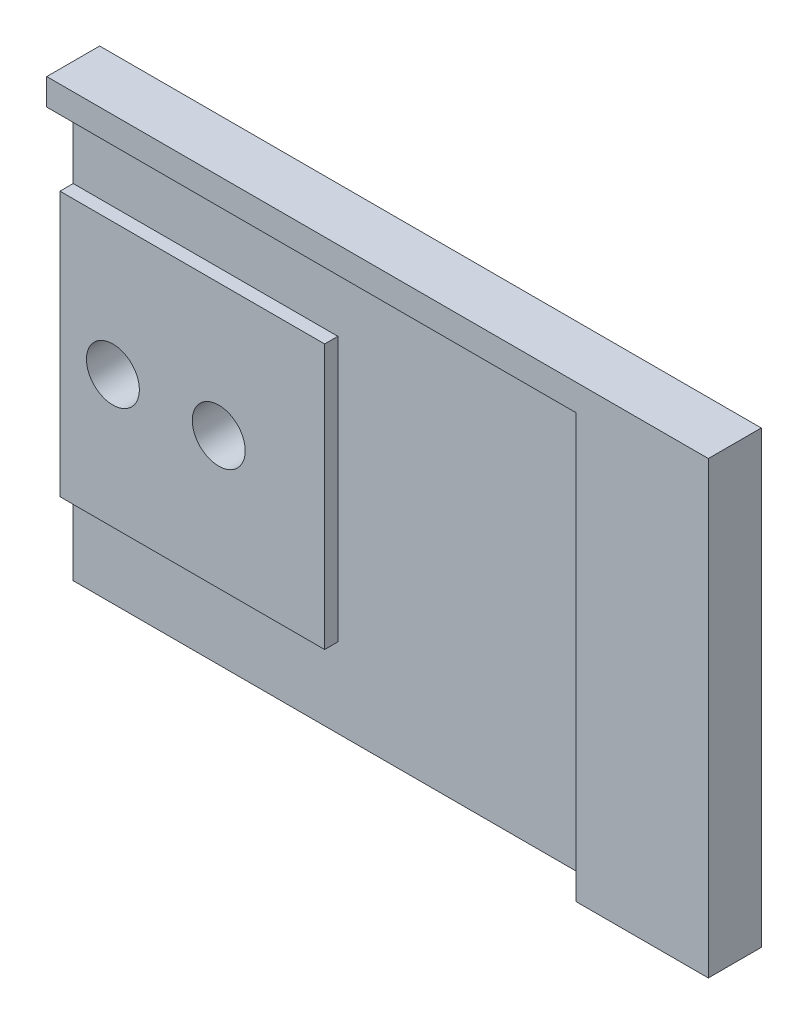
ISO-10303-21;
HEADER;
FILE_DESCRIPTION(('STEP AP214'),'2;1');
FILE_NAME('part.step','',(''),(''),'','','');
FILE_SCHEMA(('AUTOMOTIVE_DESIGN { 1 0 10303 214 1 1 1 1 }'));
ENDSEC;
DATA;
#1=APPLICATION_CONTEXT('core data for automotive mechanical design processes');
#2=APPLICATION_PROTOCOL_DEFINITION('international standard','automotive_design',2000,#1);
#3=PRODUCT_CONTEXT('',#1,'mechanical');
#4=PRODUCT('Part','Part','',(#3));
#5=PRODUCT_RELATED_PRODUCT_CATEGORY('part','',(#4));
#6=PRODUCT_DEFINITION_FORMATION('','',#4);
#7=PRODUCT_DEFINITION_CONTEXT('part definition',#1,'design');
#8=PRODUCT_DEFINITION('design','',#6,#7);
#9=PRODUCT_DEFINITION_SHAPE('','',#8);
#10=(LENGTH_UNIT() NAMED_UNIT(*) SI_UNIT(.MILLI.,.METRE.));
#11=(NAMED_UNIT(*) PLANE_ANGLE_UNIT() SI_UNIT($,.RADIAN.));
#12=(NAMED_UNIT(*) SI_UNIT($,.STERADIAN.) SOLID_ANGLE_UNIT());
#13=UNCERTAINTY_MEASURE_WITH_UNIT(LENGTH_MEASURE(1.E-05),#10,'distance_accuracy_value','');
#14=(GEOMETRIC_REPRESENTATION_CONTEXT(3) GLOBAL_UNCERTAINTY_ASSIGNED_CONTEXT((#13)) GLOBAL_UNIT_ASSIGNED_CONTEXT((#10,
#11,#12)) REPRESENTATION_CONTEXT('',''));
#15=CARTESIAN_POINT('',(0.,0.,0.));
#16=DIRECTION('',(0.,0.,1.));
#17=DIRECTION('',(1.,0.,0.));
#18=AXIS2_PLACEMENT_3D('',#15,#16,#17);
#19=CARTESIAN_POINT('',(0.,0.,5.));
#20=DIRECTION('',(0.,0.,1.));
#21=DIRECTION('',(1.,0.,0.));
#22=AXIS2_PLACEMENT_3D('',#19,#20,#21);
#23=PLANE('',#22);
#24=DIRECTION('',(0.,1.,0.));
#25=VECTOR('',#24,1.);
#26=CARTESIAN_POINT('',(3.71385187449574,0.799363057324837,5.));
#27=LINE('',#26,#25);
#28=CARTESIAN_POINT('',(3.71385187449575,-49.2006369426752,5.));
#29=VERTEX_POINT('',#28);
#30=CARTESIAN_POINT('',(3.71385187449574,0.799363057324837,5.));
#31=VERTEX_POINT('',#30);
#32=EDGE_CURVE('E251',#29,#31,#27,.T.);
#33=ORIENTED_EDGE('',*,*,#32,.F.);
#34=DIRECTION('',(1.,0.,0.));
#35=VECTOR('',#34,1.);
#36=CARTESIAN_POINT('',(-46.2861481255043,-49.2006369426752,5.));
#37=LINE('',#36,#35);
#38=CARTESIAN_POINT('',(-46.2861481255043,-49.2006369426752,5.));
#39=VERTEX_POINT('',#38);
#40=EDGE_CURVE('E248',#39,#29,#37,.T.);
#41=ORIENTED_EDGE('',*,*,#40,.F.);
#42=DIRECTION('',(0.,-1.,0.));
#43=VECTOR('',#42,1.);
#44=CARTESIAN_POINT('',(-46.2861481255043,15.7993630573248,5.));
#45=LINE('',#44,#43);
#46=CARTESIAN_POINT('',(-46.2861481255043,-64.2006369426752,5.));
#47=VERTEX_POINT('',#46);
#48=EDGE_CURVE('E149',#39,#47,#45,.T.);
#49=ORIENTED_EDGE('',*,*,#48,.T.);
#50=DIRECTION('',(1.,0.,0.));
#51=VECTOR('',#50,1.);
#52=CARTESIAN_POINT('',(-46.2861481255043,-64.2006369426752,5.));
#53=LINE('',#52,#51);
#54=CARTESIAN_POINT('',(53.7138518744958,-64.2006369426752,5.));
#55=VERTEX_POINT('',#54);
#56=EDGE_CURVE('E164',#47,#55,#53,.T.);
#57=ORIENTED_EDGE('',*,*,#56,.T.);
#58=DIRECTION('',(0.,1.,0.));
#59=VECTOR('',#58,1.);
#60=CARTESIAN_POINT('',(53.7138518744957,15.7993630573248,5.));
#61=LINE('',#60,#59);
#62=CARTESIAN_POINT('',(53.7138518744957,15.7993630573248,5.));
#63=VERTEX_POINT('',#62);
#64=EDGE_CURVE('E168',#55,#63,#61,.T.);
#65=ORIENTED_EDGE('',*,*,#64,.T.);
#66=DIRECTION('',(-1.,0.,0.));
#67=VECTOR('',#66,1.);
#68=CARTESIAN_POINT('',(-46.2861481255043,15.7993630573248,5.));
#69=LINE('',#68,#67);
#70=CARTESIAN_POINT('',(-46.2861481255043,15.7993630573248,5.));
#71=VERTEX_POINT('',#70);
#72=EDGE_CURVE('E172',#63,#71,#69,.T.);
#73=ORIENTED_EDGE('',*,*,#72,.T.);
#74=CARTESIAN_POINT('',(-46.2861481255043,0.799363057324837,5.));
#75=VERTEX_POINT('',#74);
#76=EDGE_CURVE('E160',#71,#75,#45,.T.);
#77=ORIENTED_EDGE('',*,*,#76,.T.);
#78=DIRECTION('',(-1.,0.,0.));
#79=VECTOR('',#78,1.);
#80=CARTESIAN_POINT('',(-46.2861481255043,0.799363057324837,5.));
#81=LINE('',#80,#79);
#82=EDGE_CURVE('E144',#31,#75,#81,.T.);
#83=ORIENTED_EDGE('',*,*,#82,.F.);
#84=EDGE_LOOP('',(#33,#41,#49,#57,#65,#73,#77,#83));
#85=FACE_BOUND('',#84,.T.);
#86=ADVANCED_FACE('F39',(#85),#23,.T.);
#87=CARTESIAN_POINT('',(-46.2861481255043,20.7993630573248,10.));
#88=DIRECTION('',(1.,0.,0.));
#89=DIRECTION('',(0.,1.,0.));
#90=AXIS2_PLACEMENT_3D('',#87,#88,#89);
#91=PLANE('',#90);
#92=ORIENTED_EDGE('',*,*,#76,.F.);
#93=DIRECTION('',(0.,0.,1.));
#94=VECTOR('',#93,1.);
#95=CARTESIAN_POINT('',(-46.2861481255043,15.7993630573248,5.));
#96=LINE('',#95,#94);
#97=CARTESIAN_POINT('',(-46.2861481255043,15.7993630573248,10.));
#98=VERTEX_POINT('',#97);
#99=EDGE_CURVE('E178',#71,#98,#96,.T.);
#100=ORIENTED_EDGE('',*,*,#99,.T.);
#101=DIRECTION('',(0.,-1.,0.));
#102=VECTOR('',#101,1.);
#103=CARTESIAN_POINT('',(-46.2861481255043,20.7993630573248,10.));
#104=LINE('',#103,#102);
#105=CARTESIAN_POINT('',(-46.2861481255043,20.7993630573248,10.));
#106=VERTEX_POINT('',#105);
#107=EDGE_CURVE('E188',#106,#98,#104,.T.);
#108=ORIENTED_EDGE('',*,*,#107,.F.);
#109=DIRECTION('',(0.,0.,-1.));
#110=VECTOR('',#109,1.);
#111=CARTESIAN_POINT('',(-46.2861481255043,20.7993630573248,10.));
#112=LINE('',#111,#110);
#113=CARTESIAN_POINT('',(-46.2861481255043,20.7993630573248,0.));
#114=VERTEX_POINT('',#113);
#115=EDGE_CURVE('E202',#106,#114,#112,.T.);
#116=ORIENTED_EDGE('',*,*,#115,.T.);
#117=DIRECTION('',(0.,-1.,0.));
#118=VECTOR('',#117,1.);
#119=CARTESIAN_POINT('',(-46.2861481255043,20.7993630573248,0.));
#120=LINE('',#119,#118);
#121=CARTESIAN_POINT('',(-46.2861481255042,-64.2006369426752,0.));
#122=VERTEX_POINT('',#121);
#123=EDGE_CURVE('E182',#114,#122,#120,.T.);
#124=ORIENTED_EDGE('',*,*,#123,.T.);
#125=DIRECTION('',(0.,0.,-1.));
#126=VECTOR('',#125,1.);
#127=CARTESIAN_POINT('',(-46.2861481255042,-64.2006369426752,10.));
#128=LINE('',#127,#126);
#129=EDGE_CURVE('E11',#47,#122,#128,.T.);
#130=ORIENTED_EDGE('',*,*,#129,.F.);
#131=ORIENTED_EDGE('',*,*,#48,.F.);
#132=DIRECTION('',(0.,0.,-1.));
#133=VECTOR('',#132,1.);
#134=CARTESIAN_POINT('',(-46.2861481255043,-49.2006369426752,7.5));
#135=LINE('',#134,#133);
#136=CARTESIAN_POINT('',(-46.2861481255043,-49.2006369426752,7.5));
#137=VERTEX_POINT('',#136);
#138=EDGE_CURVE('E127',#137,#39,#135,.T.);
#139=ORIENTED_EDGE('',*,*,#138,.F.);
#140=DIRECTION('',(0.,-1.,0.));
#141=VECTOR('',#140,1.);
#142=CARTESIAN_POINT('',(-46.2861481255043,0.799363057324837,7.5));
#143=LINE('',#142,#141);
#144=CARTESIAN_POINT('',(-46.2861481255043,0.799363057324837,7.5));
#145=VERTEX_POINT('',#144);
#146=EDGE_CURVE('E135',#145,#137,#143,.T.);
#147=ORIENTED_EDGE('',*,*,#146,.F.);
#148=DIRECTION('',(0.,0.,-1.));
#149=VECTOR('',#148,1.);
#150=CARTESIAN_POINT('',(-46.2861481255043,0.799363057324837,7.5));
#151=LINE('',#150,#149);
#152=EDGE_CURVE('E266',#145,#75,#151,.T.);
#153=ORIENTED_EDGE('',*,*,#152,.T.);
#154=EDGE_LOOP('',(#92,#100,#108,#116,#124,#130,#131,#139,#147,#153));
#155=FACE_BOUND('',#154,.T.);
#156=ADVANCED_FACE('F41',(#155),#91,.F.);
#157=CARTESIAN_POINT('',(-46.2861481255042,-64.2006369426752,10.));
#158=DIRECTION('',(0.,1.,0.));
#159=DIRECTION('',(0.,0.,1.));
#160=AXIS2_PLACEMENT_3D('',#157,#158,#159);
#161=PLANE('',#160);
#162=DIRECTION('',(1.,0.,0.));
#163=VECTOR('',#162,1.);
#164=CARTESIAN_POINT('',(-46.2861481255042,-64.2006369426752,10.));
#165=LINE('',#164,#163);
#166=CARTESIAN_POINT('',(53.7138518744958,-64.2006369426752,10.));
#167=VERTEX_POINT('',#166);
#168=CARTESIAN_POINT('',(78.7138518744958,-64.2006369426752,10.));
#169=VERTEX_POINT('',#168);
#170=EDGE_CURVE('E192',#167,#169,#165,.T.);
#171=ORIENTED_EDGE('',*,*,#170,.F.);
#172=DIRECTION('',(0.,0.,1.));
#173=VECTOR('',#172,1.);
#174=CARTESIAN_POINT('',(53.7138518744958,-64.2006369426752,5.));
#175=LINE('',#174,#173);
#176=EDGE_CURVE('E63',#55,#167,#175,.T.);
#177=ORIENTED_EDGE('',*,*,#176,.F.);
#178=ORIENTED_EDGE('',*,*,#56,.F.);
#179=ORIENTED_EDGE('',*,*,#129,.T.);
#180=DIRECTION('',(1.,0.,0.));
#181=VECTOR('',#180,1.);
#182=CARTESIAN_POINT('',(-46.2861481255042,-64.2006369426752,0.));
#183=LINE('',#182,#181);
#184=CARTESIAN_POINT('',(78.7138518744958,-64.2006369426752,0.));
#185=VERTEX_POINT('',#184);
#186=EDGE_CURVE('E206',#122,#185,#183,.T.);
#187=ORIENTED_EDGE('',*,*,#186,.T.);
#188=DIRECTION('',(0.,0.,-1.));
#189=VECTOR('',#188,1.);
#190=CARTESIAN_POINT('',(78.7138518744958,-64.2006369426752,10.));
#191=LINE('',#190,#189);
#192=EDGE_CURVE('E48',#169,#185,#191,.T.);
#193=ORIENTED_EDGE('',*,*,#192,.F.);
#194=EDGE_LOOP('',(#171,#177,#178,#179,#187,#193));
#195=FACE_BOUND('',#194,.T.);
#196=ADVANCED_FACE('F243',(#195),#161,.F.);
#197=CARTESIAN_POINT('',(78.7138518744958,20.7993630573248,10.));
#198=DIRECTION('',(-1.,0.,0.));
#199=DIRECTION('',(0.,0.,1.));
#200=AXIS2_PLACEMENT_3D('',#197,#198,#199);
#201=PLANE('',#200);
#202=DIRECTION('',(0.,1.,0.));
#203=VECTOR('',#202,1.);
#204=CARTESIAN_POINT('',(78.7138518744958,20.7993630573248,0.));
#205=LINE('',#204,#203);
#206=CARTESIAN_POINT('',(78.7138518744958,20.7993630573248,0.));
#207=VERTEX_POINT('',#206);
#208=EDGE_CURVE('E209',#185,#207,#205,.T.);
#209=ORIENTED_EDGE('',*,*,#208,.T.);
#210=DIRECTION('',(0.,0.,-1.));
#211=VECTOR('',#210,1.);
#212=CARTESIAN_POINT('',(78.7138518744958,20.7993630573248,10.));
#213=LINE('',#212,#211);
#214=CARTESIAN_POINT('',(78.7138518744958,20.7993630573248,10.));
#215=VERTEX_POINT('',#214);
#216=EDGE_CURVE('E217',#215,#207,#213,.T.);
#217=ORIENTED_EDGE('',*,*,#216,.F.);
#218=DIRECTION('',(0.,1.,0.));
#219=VECTOR('',#218,1.);
#220=CARTESIAN_POINT('',(78.7138518744958,20.7993630573248,10.));
#221=LINE('',#220,#219);
#222=EDGE_CURVE('E196',#169,#215,#221,.T.);
#223=ORIENTED_EDGE('',*,*,#222,.F.);
#224=ORIENTED_EDGE('',*,*,#192,.T.);
#225=EDGE_LOOP('',(#209,#217,#223,#224));
#226=FACE_BOUND('',#225,.T.);
#227=ADVANCED_FACE('F226',(#226),#201,.F.);
#228=CARTESIAN_POINT('',(-46.2861481255043,20.7993630573248,10.));
#229=DIRECTION('',(0.,-1.,0.));
#230=DIRECTION('',(0.,0.,-1.));
#231=AXIS2_PLACEMENT_3D('',#228,#229,#230);
#232=PLANE('',#231);
#233=DIRECTION('',(-1.,0.,0.));
#234=VECTOR('',#233,1.);
#235=CARTESIAN_POINT('',(-46.2861481255043,20.7993630573248,0.));
#236=LINE('',#235,#234);
#237=EDGE_CURVE('E193',#207,#114,#236,.T.);
#238=ORIENTED_EDGE('',*,*,#237,.T.);
#239=ORIENTED_EDGE('',*,*,#115,.F.);
#240=DIRECTION('',(-1.,0.,0.));
#241=VECTOR('',#240,1.);
#242=CARTESIAN_POINT('',(-46.2861481255043,20.7993630573248,10.));
#243=LINE('',#242,#241);
#244=EDGE_CURVE('E199',#215,#106,#243,.T.);
#245=ORIENTED_EDGE('',*,*,#244,.F.);
#246=ORIENTED_EDGE('',*,*,#216,.T.);
#247=EDGE_LOOP('',(#238,#239,#245,#246));
#248=FACE_BOUND('',#247,.T.);
#249=ADVANCED_FACE('F237',(#248),#232,.F.);
#250=CARTESIAN_POINT('',(0.,0.,10.));
#251=DIRECTION('',(0.,0.,1.));
#252=DIRECTION('',(1.,0.,0.));
#253=AXIS2_PLACEMENT_3D('',#250,#251,#252);
#254=PLANE('',#253);
#255=DIRECTION('',(-1.,0.,0.));
#256=VECTOR('',#255,1.);
#257=CARTESIAN_POINT('',(-46.2861481255043,15.7993630573248,10.));
#258=LINE('',#257,#256);
#259=CARTESIAN_POINT('',(53.7138518744957,15.7993630573248,10.));
#260=VERTEX_POINT('',#259);
#261=EDGE_CURVE('E155',#260,#98,#258,.T.);
#262=ORIENTED_EDGE('',*,*,#261,.F.);
#263=DIRECTION('',(0.,1.,0.));
#264=VECTOR('',#263,1.);
#265=CARTESIAN_POINT('',(53.7138518744957,15.7993630573248,10.));
#266=LINE('',#265,#264);
#267=EDGE_CURVE('E151',#167,#260,#266,.T.);
#268=ORIENTED_EDGE('',*,*,#267,.F.);
#269=ORIENTED_EDGE('',*,*,#170,.T.);
#270=ORIENTED_EDGE('',*,*,#222,.T.);
#271=ORIENTED_EDGE('',*,*,#244,.T.);
#272=ORIENTED_EDGE('',*,*,#107,.T.);
#273=EDGE_LOOP('',(#262,#268,#269,#270,#271,#272));
#274=FACE_BOUND('',#273,.T.);
#275=ADVANCED_FACE('F242',(#274),#254,.T.);
#276=CARTESIAN_POINT('',(0.,0.,0.));
#277=DIRECTION('',(0.,0.,1.));
#278=DIRECTION('',(1.,0.,0.));
#279=AXIS2_PLACEMENT_3D('',#276,#277,#278);
#280=PLANE('',#279);
#281=CARTESIAN_POINT('',(-36.2861481255043,-24.2006369426752,0.));
#282=DIRECTION('',(0.,0.,1.));
#283=DIRECTION('',(1.,0.,0.));
#284=AXIS2_PLACEMENT_3D('',#281,#282,#283);
#285=CIRCLE('',#284,5.);
#286=CARTESIAN_POINT('',(-31.2861481255043,-24.2006369426752,0.));
#287=VERTEX_POINT('',#286);
#288=EDGE_CURVE('E253',#287,#287,#285,.T.);
#289=ORIENTED_EDGE('',*,*,#288,.T.);
#290=EDGE_LOOP('',(#289));
#291=FACE_BOUND('',#290,.T.);
#292=CARTESIAN_POINT('',(-16.2861481255043,-24.2006369426752,0.));
#293=DIRECTION('',(0.,0.,1.));
#294=DIRECTION('',(1.,0.,0.));
#295=AXIS2_PLACEMENT_3D('',#292,#293,#294);
#296=CIRCLE('',#295,5.);
#297=CARTESIAN_POINT('',(-11.2861481255043,-24.2006369426752,0.));
#298=VERTEX_POINT('',#297);
#299=EDGE_CURVE('E259',#298,#298,#296,.T.);
#300=ORIENTED_EDGE('',*,*,#299,.T.);
#301=EDGE_LOOP('',(#300));
#302=FACE_BOUND('',#301,.T.);
#303=ORIENTED_EDGE('',*,*,#123,.F.);
#304=ORIENTED_EDGE('',*,*,#237,.F.);
#305=ORIENTED_EDGE('',*,*,#208,.F.);
#306=ORIENTED_EDGE('',*,*,#186,.F.);
#307=EDGE_LOOP('',(#303,#304,#305,#306));
#308=FACE_BOUND('',#307,.T.);
#309=ADVANCED_FACE('F234',(#291,#302,#308),#280,.F.);
#310=CARTESIAN_POINT('',(-46.2861481255043,15.7993630573248,5.));
#311=DIRECTION('',(0.,1.,0.));
#312=DIRECTION('',(0.,0.,1.));
#313=AXIS2_PLACEMENT_3D('',#310,#311,#312);
#314=PLANE('',#313);
#315=ORIENTED_EDGE('',*,*,#261,.T.);
#316=ORIENTED_EDGE('',*,*,#99,.F.);
#317=ORIENTED_EDGE('',*,*,#72,.F.);
#318=DIRECTION('',(0.,0.,1.));
#319=VECTOR('',#318,1.);
#320=CARTESIAN_POINT('',(53.7138518744957,15.7993630573248,5.));
#321=LINE('',#320,#319);
#322=EDGE_CURVE('E183',#63,#260,#321,.T.);
#323=ORIENTED_EDGE('',*,*,#322,.T.);
#324=EDGE_LOOP('',(#315,#316,#317,#323));
#325=FACE_BOUND('',#324,.T.);
#326=ADVANCED_FACE('F300',(#325),#314,.F.);
#327=CARTESIAN_POINT('',(53.7138518744957,15.7993630573248,5.));
#328=DIRECTION('',(1.,0.,0.));
#329=DIRECTION('',(0.,1.,0.));
#330=AXIS2_PLACEMENT_3D('',#327,#328,#329);
#331=PLANE('',#330);
#332=ORIENTED_EDGE('',*,*,#267,.T.);
#333=ORIENTED_EDGE('',*,*,#322,.F.);
#334=ORIENTED_EDGE('',*,*,#64,.F.);
#335=ORIENTED_EDGE('',*,*,#176,.T.);
#336=EDGE_LOOP('',(#332,#333,#334,#335));
#337=FACE_BOUND('',#336,.T.);
#338=ADVANCED_FACE('F307',(#337),#331,.F.);
#339=CARTESIAN_POINT('',(-46.2861481255043,-49.2006369426752,7.5));
#340=DIRECTION('',(0.,1.,0.));
#341=DIRECTION('',(-1.,0.,0.));
#342=AXIS2_PLACEMENT_3D('',#339,#340,#341);
#343=PLANE('',#342);
#344=ORIENTED_EDGE('',*,*,#40,.T.);
#345=DIRECTION('',(0.,0.,-1.));
#346=VECTOR('',#345,1.);
#347=CARTESIAN_POINT('',(3.71385187449575,-49.2006369426752,7.5));
#348=LINE('',#347,#346);
#349=CARTESIAN_POINT('',(3.71385187449575,-49.2006369426752,7.5));
#350=VERTEX_POINT('',#349);
#351=EDGE_CURVE('E130',#350,#29,#348,.T.);
#352=ORIENTED_EDGE('',*,*,#351,.F.);
#353=DIRECTION('',(1.,0.,0.));
#354=VECTOR('',#353,1.);
#355=CARTESIAN_POINT('',(-46.2861481255043,-49.2006369426752,7.5));
#356=LINE('',#355,#354);
#357=EDGE_CURVE('E123',#137,#350,#356,.T.);
#358=ORIENTED_EDGE('',*,*,#357,.F.);
#359=ORIENTED_EDGE('',*,*,#138,.T.);
#360=EDGE_LOOP('',(#344,#352,#358,#359));
#361=FACE_BOUND('',#360,.T.);
#362=ADVANCED_FACE('F125',(#361),#343,.F.);
#363=CARTESIAN_POINT('',(3.71385187449574,0.799363057324837,7.5));
#364=DIRECTION('',(-1.,0.,0.));
#365=DIRECTION('',(0.,-1.,0.));
#366=AXIS2_PLACEMENT_3D('',#363,#364,#365);
#367=PLANE('',#366);
#368=ORIENTED_EDGE('',*,*,#32,.T.);
#369=DIRECTION('',(0.,0.,-1.));
#370=VECTOR('',#369,1.);
#371=CARTESIAN_POINT('',(3.71385187449574,0.799363057324837,7.5));
#372=LINE('',#371,#370);
#373=CARTESIAN_POINT('',(3.71385187449574,0.799363057324837,7.5));
#374=VERTEX_POINT('',#373);
#375=EDGE_CURVE('E55',#374,#31,#372,.T.);
#376=ORIENTED_EDGE('',*,*,#375,.F.);
#377=DIRECTION('',(0.,1.,0.));
#378=VECTOR('',#377,1.);
#379=CARTESIAN_POINT('',(3.71385187449574,0.799363057324837,7.5));
#380=LINE('',#379,#378);
#381=EDGE_CURVE('E134',#350,#374,#380,.T.);
#382=ORIENTED_EDGE('',*,*,#381,.F.);
#383=ORIENTED_EDGE('',*,*,#351,.T.);
#384=EDGE_LOOP('',(#368,#376,#382,#383));
#385=FACE_BOUND('',#384,.T.);
#386=ADVANCED_FACE('F324',(#385),#367,.F.);
#387=CARTESIAN_POINT('',(-46.2861481255043,0.799363057324837,7.5));
#388=DIRECTION('',(0.,-1.,0.));
#389=DIRECTION('',(0.,0.,-1.));
#390=AXIS2_PLACEMENT_3D('',#387,#388,#389);
#391=PLANE('',#390);
#392=ORIENTED_EDGE('',*,*,#82,.T.);
#393=ORIENTED_EDGE('',*,*,#152,.F.);
#394=DIRECTION('',(-1.,0.,0.));
#395=VECTOR('',#394,1.);
#396=CARTESIAN_POINT('',(-46.2861481255043,0.799363057324837,7.5));
#397=LINE('',#396,#395);
#398=EDGE_CURVE('E139',#374,#145,#397,.T.);
#399=ORIENTED_EDGE('',*,*,#398,.F.);
#400=ORIENTED_EDGE('',*,*,#375,.T.);
#401=EDGE_LOOP('',(#392,#393,#399,#400));
#402=FACE_BOUND('',#401,.T.);
#403=ADVANCED_FACE('F290',(#402),#391,.F.);
#404=CARTESIAN_POINT('',(0.,0.,7.5));
#405=DIRECTION('',(0.,0.,1.));
#406=DIRECTION('',(1.,0.,0.));
#407=AXIS2_PLACEMENT_3D('',#404,#405,#406);
#408=PLANE('',#407);
#409=CARTESIAN_POINT('',(-36.2861481255043,-24.2006369426752,7.5));
#410=DIRECTION('',(0.,0.,1.));
#411=DIRECTION('',(1.,0.,0.));
#412=AXIS2_PLACEMENT_3D('',#409,#410,#411);
#413=CIRCLE('',#412,5.);
#414=CARTESIAN_POINT('',(-31.2861481255043,-24.2006369426752,7.5));
#415=VERTEX_POINT('',#414);
#416=EDGE_CURVE('E275',#415,#415,#413,.T.);
#417=ORIENTED_EDGE('',*,*,#416,.F.);
#418=EDGE_LOOP('',(#417));
#419=FACE_BOUND('',#418,.T.);
#420=CARTESIAN_POINT('',(-16.2861481255043,-24.2006369426752,7.5));
#421=DIRECTION('',(0.,0.,1.));
#422=DIRECTION('',(1.,0.,0.));
#423=AXIS2_PLACEMENT_3D('',#420,#421,#422);
#424=CIRCLE('',#423,5.);
#425=CARTESIAN_POINT('',(-11.2861481255043,-24.2006369426752,7.5));
#426=VERTEX_POINT('',#425);
#427=EDGE_CURVE('E276',#426,#426,#424,.T.);
#428=ORIENTED_EDGE('',*,*,#427,.F.);
#429=EDGE_LOOP('',(#428));
#430=FACE_BOUND('',#429,.T.);
#431=ORIENTED_EDGE('',*,*,#146,.T.);
#432=ORIENTED_EDGE('',*,*,#357,.T.);
#433=ORIENTED_EDGE('',*,*,#381,.T.);
#434=ORIENTED_EDGE('',*,*,#398,.T.);
#435=EDGE_LOOP('',(#431,#432,#433,#434));
#436=FACE_BOUND('',#435,.T.);
#437=ADVANCED_FACE('F138',(#419,#430,#436),#408,.T.);
#438=CARTESIAN_POINT('',(-16.2861481255043,-24.2006369426752,-15.));
#439=DIRECTION('',(0.,0.,1.));
#440=DIRECTION('',(1.,0.,0.));
#441=AXIS2_PLACEMENT_3D('',#438,#439,#440);
#442=CYLINDRICAL_SURFACE('',#441,5.);
#443=CARTESIAN_POINT('',(-11.2861481255043,-24.2006369426752,7.5));
#444=CARTESIAN_POINT('',(-11.2861481255043,-24.2006369426752,7.421875));
#445=CARTESIAN_POINT('',(-11.2861481255043,-24.2006369426752,7.34375));
#446=CARTESIAN_POINT('',(-11.2861481255043,-24.2006369426752,7.1875));
#447=CARTESIAN_POINT('',(-11.2861481255043,-24.2006369426752,7.109375));
#448=CARTESIAN_POINT('',(-11.2861481255043,-24.2006369426752,6.953125));
#449=CARTESIAN_POINT('',(-11.2861481255043,-24.2006369426752,6.875));
#450=CARTESIAN_POINT('',(-11.2861481255043,-24.2006369426752,6.71875));
#451=CARTESIAN_POINT('',(-11.2861481255043,-24.2006369426752,6.640625));
#452=CARTESIAN_POINT('',(-11.2861481255043,-24.2006369426752,6.484375));
#453=CARTESIAN_POINT('',(-11.2861481255043,-24.2006369426752,6.40625));
#454=CARTESIAN_POINT('',(-11.2861481255043,-24.2006369426752,6.25));
#455=CARTESIAN_POINT('',(-11.2861481255043,-24.2006369426752,6.171875));
#456=CARTESIAN_POINT('',(-11.2861481255043,-24.2006369426752,6.015625));
#457=CARTESIAN_POINT('',(-11.2861481255043,-24.2006369426752,5.9375));
#458=CARTESIAN_POINT('',(-11.2861481255043,-24.2006369426752,5.78125));
#459=CARTESIAN_POINT('',(-11.2861481255043,-24.2006369426752,5.703125));
#460=CARTESIAN_POINT('',(-11.2861481255043,-24.2006369426752,5.546875));
#461=CARTESIAN_POINT('',(-11.2861481255043,-24.2006369426752,5.46875));
#462=CARTESIAN_POINT('',(-11.2861481255043,-24.2006369426752,5.3125));
#463=CARTESIAN_POINT('',(-11.2861481255043,-24.2006369426752,5.234375));
#464=CARTESIAN_POINT('',(-11.2861481255043,-24.2006369426752,5.078125));
#465=CARTESIAN_POINT('',(-11.2861481255043,-24.2006369426752,5.));
#466=CARTESIAN_POINT('',(-11.2861481255043,-24.2006369426752,4.84375));
#467=CARTESIAN_POINT('',(-11.2861481255043,-24.2006369426752,4.765625));
#468=CARTESIAN_POINT('',(-11.2861481255043,-24.2006369426752,4.609375));
#469=CARTESIAN_POINT('',(-11.2861481255043,-24.2006369426752,4.53125));
#470=CARTESIAN_POINT('',(-11.2861481255043,-24.2006369426752,4.375));
#471=CARTESIAN_POINT('',(-11.2861481255043,-24.2006369426752,4.296875));
#472=CARTESIAN_POINT('',(-11.2861481255043,-24.2006369426752,4.140625));
#473=CARTESIAN_POINT('',(-11.2861481255043,-24.2006369426752,4.0625));
#474=CARTESIAN_POINT('',(-11.2861481255043,-24.2006369426752,3.90625));
#475=CARTESIAN_POINT('',(-11.2861481255043,-24.2006369426752,3.828125));
#476=CARTESIAN_POINT('',(-11.2861481255043,-24.2006369426752,3.671875));
#477=CARTESIAN_POINT('',(-11.2861481255043,-24.2006369426752,3.59375));
#478=CARTESIAN_POINT('',(-11.2861481255043,-24.2006369426752,3.4375));
#479=CARTESIAN_POINT('',(-11.2861481255043,-24.2006369426752,3.359375));
#480=CARTESIAN_POINT('',(-11.2861481255043,-24.2006369426752,3.203125));
#481=CARTESIAN_POINT('',(-11.2861481255043,-24.2006369426752,3.125));
#482=CARTESIAN_POINT('',(-11.2861481255043,-24.2006369426752,2.96875));
#483=CARTESIAN_POINT('',(-11.2861481255043,-24.2006369426752,2.890625));
#484=CARTESIAN_POINT('',(-11.2861481255043,-24.2006369426752,2.734375));
#485=CARTESIAN_POINT('',(-11.2861481255043,-24.2006369426752,2.65625));
#486=CARTESIAN_POINT('',(-11.2861481255043,-24.2006369426752,2.5));
#487=CARTESIAN_POINT('',(-11.2861481255043,-24.2006369426752,2.421875));
#488=CARTESIAN_POINT('',(-11.2861481255043,-24.2006369426752,2.265625));
#489=CARTESIAN_POINT('',(-11.2861481255043,-24.2006369426752,2.1875));
#490=CARTESIAN_POINT('',(-11.2861481255043,-24.2006369426752,2.03125));
#491=CARTESIAN_POINT('',(-11.2861481255043,-24.2006369426752,1.953125));
#492=CARTESIAN_POINT('',(-11.2861481255043,-24.2006369426752,1.796875));
#493=CARTESIAN_POINT('',(-11.2861481255043,-24.2006369426752,1.71875));
#494=CARTESIAN_POINT('',(-11.2861481255043,-24.2006369426752,1.5625));
#495=CARTESIAN_POINT('',(-11.2861481255043,-24.2006369426752,1.484375));
#496=CARTESIAN_POINT('',(-11.2861481255043,-24.2006369426752,1.32812499999999));
#497=CARTESIAN_POINT('',(-11.2861481255043,-24.2006369426752,1.25));
#498=CARTESIAN_POINT('',(-11.2861481255043,-24.2006369426752,1.09375));
#499=CARTESIAN_POINT('',(-11.2861481255043,-24.2006369426752,1.015625));
#500=CARTESIAN_POINT('',(-11.2861481255043,-24.2006369426752,0.859374999999997));
#501=CARTESIAN_POINT('',(-11.2861481255043,-24.2006369426752,0.781249999999996));
#502=CARTESIAN_POINT('',(-11.2861481255043,-24.2006369426752,0.624999999999997));
#503=CARTESIAN_POINT('',(-11.2861481255043,-24.2006369426752,0.546874999999998));
#504=CARTESIAN_POINT('',(-11.2861481255043,-24.2006369426752,0.390624999999999));
#505=CARTESIAN_POINT('',(-11.2861481255043,-24.2006369426752,0.312499999999999));
#506=CARTESIAN_POINT('',(-11.2861481255043,-24.2006369426752,0.156249999999998));
#507=CARTESIAN_POINT('',(-11.2861481255043,-24.2006369426752,0.0781249999999984));
#508=CARTESIAN_POINT('',(-11.2861481255043,-24.2006369426752,0.));
#509=B_SPLINE_CURVE_WITH_KNOTS('',3,(#443,#444,#445,#446,#447,#448,#449,#450,#451,#452,#453,
#454,#455,#456,#457,#458,#459,#460,#461,#462,#463,#464,#465,#466,#467,#468,#469,#470,#471,#472,
#473,#474,#475,#476,#477,#478,#479,#480,#481,#482,#483,#484,#485,#486,#487,#488,#489,#490,#491,
#492,#493,#494,#495,#496,#497,#498,#499,#500,#501,#502,#503,#504,#505,#506,#507,#508),
.UNSPECIFIED.,.F.,.F.,(4,2,2,2,2,2,2,2,2,2,2,2,2,2,2,2,2,2,2,2,2,2,2,2,2,2,2,2,2,2,2,2,4),(0.,
0.234374999999998,0.46875,0.703124999999999,0.937500000000001,1.171875,1.40625,1.640625,1.875,
2.109375,2.34375,2.578125,2.8125,3.046875,3.28125,3.515625,3.75,3.984375,4.21875,4.453125,
4.6875,4.921875,5.15625,5.390625,5.625,5.859375,6.09375,6.328125,6.5625,6.796875,7.03125,
7.265625,7.5),.UNSPECIFIED.);
#510=EDGE_CURVE('BSEAM289',#426,#298,#509,.T.);
#511=ORIENTED_EDGE('',*,*,#427,.T.);
#512=ORIENTED_EDGE('',*,*,#299,.F.);
#513=ORIENTED_EDGE('',*,*,#510,.T.);
#514=ORIENTED_EDGE('',*,*,#510,.F.);
#515=EDGE_LOOP('',(#511,#513,#512,#514));
#516=FACE_BOUND('',#515,.T.);
#517=ADVANCED_FACE('F289',(#516),#442,.F.);
#518=CARTESIAN_POINT('',(-36.2861481255043,-24.2006369426752,-15.));
#519=DIRECTION('',(0.,0.,1.));
#520=DIRECTION('',(1.,0.,0.));
#521=AXIS2_PLACEMENT_3D('',#518,#519,#520);
#522=CYLINDRICAL_SURFACE('',#521,5.);
#523=CARTESIAN_POINT('',(-31.2861481255043,-24.2006369426752,7.5));
#524=CARTESIAN_POINT('',(-31.2861481255043,-24.2006369426752,7.421875));
#525=CARTESIAN_POINT('',(-31.2861481255043,-24.2006369426752,7.34375));
#526=CARTESIAN_POINT('',(-31.2861481255043,-24.2006369426752,7.1875));
#527=CARTESIAN_POINT('',(-31.2861481255043,-24.2006369426752,7.109375));
#528=CARTESIAN_POINT('',(-31.2861481255043,-24.2006369426752,6.953125));
#529=CARTESIAN_POINT('',(-31.2861481255043,-24.2006369426752,6.875));
#530=CARTESIAN_POINT('',(-31.2861481255043,-24.2006369426752,6.71875));
#531=CARTESIAN_POINT('',(-31.2861481255043,-24.2006369426752,6.640625));
#532=CARTESIAN_POINT('',(-31.2861481255043,-24.2006369426752,6.484375));
#533=CARTESIAN_POINT('',(-31.2861481255043,-24.2006369426752,6.40625));
#534=CARTESIAN_POINT('',(-31.2861481255043,-24.2006369426752,6.25));
#535=CARTESIAN_POINT('',(-31.2861481255043,-24.2006369426752,6.171875));
#536=CARTESIAN_POINT('',(-31.2861481255043,-24.2006369426752,6.015625));
#537=CARTESIAN_POINT('',(-31.2861481255043,-24.2006369426752,5.9375));
#538=CARTESIAN_POINT('',(-31.2861481255043,-24.2006369426752,5.78125));
#539=CARTESIAN_POINT('',(-31.2861481255043,-24.2006369426752,5.703125));
#540=CARTESIAN_POINT('',(-31.2861481255043,-24.2006369426752,5.546875));
#541=CARTESIAN_POINT('',(-31.2861481255043,-24.2006369426752,5.46875));
#542=CARTESIAN_POINT('',(-31.2861481255043,-24.2006369426752,5.3125));
#543=CARTESIAN_POINT('',(-31.2861481255043,-24.2006369426752,5.234375));
#544=CARTESIAN_POINT('',(-31.2861481255043,-24.2006369426752,5.078125));
#545=CARTESIAN_POINT('',(-31.2861481255043,-24.2006369426752,5.));
#546=CARTESIAN_POINT('',(-31.2861481255043,-24.2006369426752,4.84375));
#547=CARTESIAN_POINT('',(-31.2861481255043,-24.2006369426752,4.765625));
#548=CARTESIAN_POINT('',(-31.2861481255043,-24.2006369426752,4.609375));
#549=CARTESIAN_POINT('',(-31.2861481255043,-24.2006369426752,4.53125));
#550=CARTESIAN_POINT('',(-31.2861481255043,-24.2006369426752,4.375));
#551=CARTESIAN_POINT('',(-31.2861481255043,-24.2006369426752,4.296875));
#552=CARTESIAN_POINT('',(-31.2861481255043,-24.2006369426752,4.140625));
#553=CARTESIAN_POINT('',(-31.2861481255043,-24.2006369426752,4.0625));
#554=CARTESIAN_POINT('',(-31.2861481255043,-24.2006369426752,3.90625));
#555=CARTESIAN_POINT('',(-31.2861481255043,-24.2006369426752,3.828125));
#556=CARTESIAN_POINT('',(-31.2861481255043,-24.2006369426752,3.671875));
#557=CARTESIAN_POINT('',(-31.2861481255043,-24.2006369426752,3.59375));
#558=CARTESIAN_POINT('',(-31.2861481255043,-24.2006369426752,3.4375));
#559=CARTESIAN_POINT('',(-31.2861481255043,-24.2006369426752,3.359375));
#560=CARTESIAN_POINT('',(-31.2861481255043,-24.2006369426752,3.203125));
#561=CARTESIAN_POINT('',(-31.2861481255043,-24.2006369426752,3.125));
#562=CARTESIAN_POINT('',(-31.2861481255043,-24.2006369426752,2.96875));
#563=CARTESIAN_POINT('',(-31.2861481255043,-24.2006369426752,2.890625));
#564=CARTESIAN_POINT('',(-31.2861481255043,-24.2006369426752,2.734375));
#565=CARTESIAN_POINT('',(-31.2861481255043,-24.2006369426752,2.65625));
#566=CARTESIAN_POINT('',(-31.2861481255043,-24.2006369426752,2.5));
#567=CARTESIAN_POINT('',(-31.2861481255043,-24.2006369426752,2.421875));
#568=CARTESIAN_POINT('',(-31.2861481255043,-24.2006369426752,2.265625));
#569=CARTESIAN_POINT('',(-31.2861481255043,-24.2006369426752,2.1875));
#570=CARTESIAN_POINT('',(-31.2861481255043,-24.2006369426752,2.03125));
#571=CARTESIAN_POINT('',(-31.2861481255043,-24.2006369426752,1.953125));
#572=CARTESIAN_POINT('',(-31.2861481255043,-24.2006369426752,1.796875));
#573=CARTESIAN_POINT('',(-31.2861481255043,-24.2006369426752,1.71875));
#574=CARTESIAN_POINT('',(-31.2861481255043,-24.2006369426752,1.5625));
#575=CARTESIAN_POINT('',(-31.2861481255043,-24.2006369426752,1.484375));
#576=CARTESIAN_POINT('',(-31.2861481255043,-24.2006369426752,1.32812499999999));
#577=CARTESIAN_POINT('',(-31.2861481255043,-24.2006369426752,1.25));
#578=CARTESIAN_POINT('',(-31.2861481255043,-24.2006369426752,1.09375));
#579=CARTESIAN_POINT('',(-31.2861481255043,-24.2006369426752,1.015625));
#580=CARTESIAN_POINT('',(-31.2861481255043,-24.2006369426752,0.859374999999997));
#581=CARTESIAN_POINT('',(-31.2861481255043,-24.2006369426752,0.781249999999996));
#582=CARTESIAN_POINT('',(-31.2861481255043,-24.2006369426752,0.624999999999997));
#583=CARTESIAN_POINT('',(-31.2861481255043,-24.2006369426752,0.546874999999998));
#584=CARTESIAN_POINT('',(-31.2861481255043,-24.2006369426752,0.390624999999999));
#585=CARTESIAN_POINT('',(-31.2861481255043,-24.2006369426752,0.312499999999999));
#586=CARTESIAN_POINT('',(-31.2861481255043,-24.2006369426752,0.156249999999998));
#587=CARTESIAN_POINT('',(-31.2861481255043,-24.2006369426752,0.0781249999999984));
#588=CARTESIAN_POINT('',(-31.2861481255043,-24.2006369426752,0.));
#589=B_SPLINE_CURVE_WITH_KNOTS('',3,(#523,#524,#525,#526,#527,#528,#529,#530,#531,#532,#533,
#534,#535,#536,#537,#538,#539,#540,#541,#542,#543,#544,#545,#546,#547,#548,#549,#550,#551,#552,
#553,#554,#555,#556,#557,#558,#559,#560,#561,#562,#563,#564,#565,#566,#567,#568,#569,#570,#571,
#572,#573,#574,#575,#576,#577,#578,#579,#580,#581,#582,#583,#584,#585,#586,#587,#588),
.UNSPECIFIED.,.F.,.F.,(4,2,2,2,2,2,2,2,2,2,2,2,2,2,2,2,2,2,2,2,2,2,2,2,2,2,2,2,2,2,2,2,4),(0.,
0.234374999999998,0.46875,0.703124999999999,0.937500000000001,1.171875,1.40625,1.640625,1.875,
2.109375,2.34375,2.578125,2.8125,3.046875,3.28125,3.515625,3.75,3.984375,4.21875,4.453125,
4.6875,4.921875,5.15625,5.390625,5.625,5.859375,6.09375,6.328125,6.5625,6.796875,7.03125,
7.265625,7.5),.UNSPECIFIED.);
#590=EDGE_CURVE('BSEAM284',#415,#287,#589,.T.);
#591=ORIENTED_EDGE('',*,*,#416,.T.);
#592=ORIENTED_EDGE('',*,*,#288,.F.);
#593=ORIENTED_EDGE('',*,*,#590,.T.);
#594=ORIENTED_EDGE('',*,*,#590,.F.);
#595=EDGE_LOOP('',(#591,#593,#592,#594));
#596=FACE_BOUND('',#595,.T.);
#597=ADVANCED_FACE('F284',(#596),#522,.F.);
#598=CLOSED_SHELL('',(#86,#156,#196,#227,#249,#275,#309,#326,#338,#362,#386,#403,#437,#517,#597));
#599=MANIFOLD_SOLID_BREP('B2',#598);
#600=ADVANCED_BREP_SHAPE_REPRESENTATION('',(#18,#599),#14);
#601=SHAPE_DEFINITION_REPRESENTATION(#9,#600);
ENDSEC;
END-ISO-10303-21;
